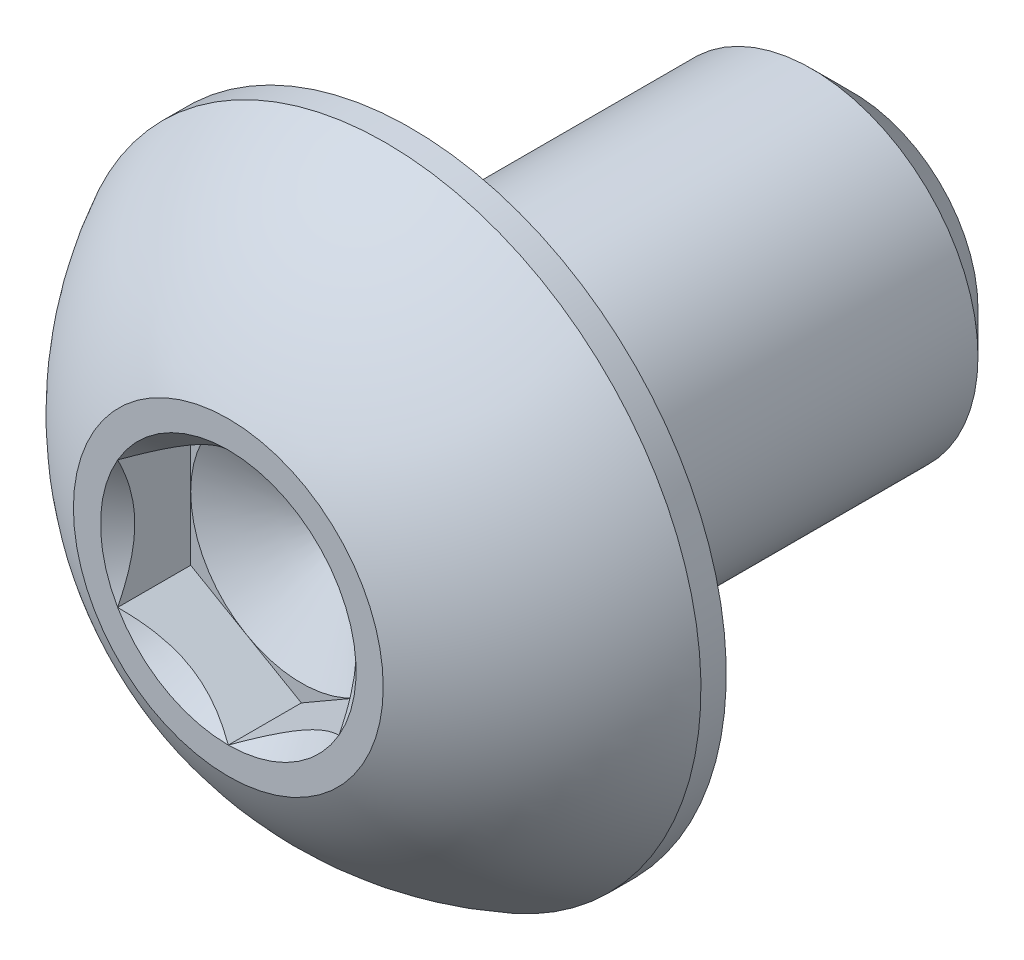
ISO-10303-21;
HEADER;
FILE_DESCRIPTION(('STEP AP214'),'2;1');
FILE_NAME('part.step','',(''),(''),'','','');
FILE_SCHEMA(('AUTOMOTIVE_DESIGN { 1 0 10303 214 1 1 1 1 }'));
ENDSEC;
DATA;
#1=APPLICATION_CONTEXT('core data for automotive mechanical design processes');
#2=APPLICATION_PROTOCOL_DEFINITION('international standard','automotive_design',2000,#1);
#3=PRODUCT_CONTEXT('',#1,'mechanical');
#4=PRODUCT('Part','Part','',(#3));
#5=PRODUCT_RELATED_PRODUCT_CATEGORY('part','',(#4));
#6=PRODUCT_DEFINITION_FORMATION('','',#4);
#7=PRODUCT_DEFINITION_CONTEXT('part definition',#1,'design');
#8=PRODUCT_DEFINITION('design','',#6,#7);
#9=PRODUCT_DEFINITION_SHAPE('','',#8);
#10=(LENGTH_UNIT() NAMED_UNIT(*) SI_UNIT(.MILLI.,.METRE.));
#11=(NAMED_UNIT(*) PLANE_ANGLE_UNIT() SI_UNIT($,.RADIAN.));
#12=(NAMED_UNIT(*) SI_UNIT($,.STERADIAN.) SOLID_ANGLE_UNIT());
#13=UNCERTAINTY_MEASURE_WITH_UNIT(LENGTH_MEASURE(1.E-05),#10,'distance_accuracy_value','');
#14=(GEOMETRIC_REPRESENTATION_CONTEXT(3) GLOBAL_UNCERTAINTY_ASSIGNED_CONTEXT((#13)) GLOBAL_UNIT_ASSIGNED_CONTEXT((#10,
#11,#12)) REPRESENTATION_CONTEXT('',''));
#15=CARTESIAN_POINT('',(0.,0.,0.));
#16=DIRECTION('',(0.,0.,1.));
#17=DIRECTION('',(1.,0.,0.));
#18=AXIS2_PLACEMENT_3D('',#15,#16,#17);
#19=CARTESIAN_POINT('',(0.,0.,2.825));
#20=DIRECTION('',(0.,0.,1.));
#21=DIRECTION('',(1.,0.,0.));
#22=AXIS2_PLACEMENT_3D('',#19,#20,#21);
#23=CONICAL_SURFACE('',#22,1.15470053837925,0.78539816339745);
#24=CARTESIAN_POINT('',(0.,0.,2.825));
#25=DIRECTION('',(0.,0.,1.));
#26=DIRECTION('',(1.,0.,0.));
#27=AXIS2_PLACEMENT_3D('',#24,#25,#26);
#28=CIRCLE('',#27,1.15470053837925);
#29=CARTESIAN_POINT('',(1.,0.577350269189626,2.825));
#30=VERTEX_POINT('',#29);
#31=CARTESIAN_POINT('',(0.,1.15470053837925,2.825));
#32=VERTEX_POINT('',#31);
#33=EDGE_CURVE('E219',#30,#32,#28,.T.);
#34=ORIENTED_EDGE('',*,*,#33,.T.);
#35=CARTESIAN_POINT('',(0.999999999999951,0.577350269189655,2.82499999999997));
#36=CARTESIAN_POINT('',(0.5,0.866025403784439,2.53632486540521));
#37=CARTESIAN_POINT('',(0.,1.15470053837922,2.82499999999997));
#38=(BOUNDED_CURVE() B_SPLINE_CURVE(2,(#35,#36,#37),.UNSPECIFIED.,.F.,
.F.) B_SPLINE_CURVE_WITH_KNOTS((3,3),(-0.3218671551163,-0.124274873543866),
.UNSPECIFIED.) CURVE() GEOMETRIC_REPRESENTATION_ITEM() RATIONAL_B_SPLINE_CURVE((1.46410161513778,
1.69059892324148,1.46410161513778)) REPRESENTATION_ITEM(''));
#39=EDGE_CURVE('E240',#30,#32,#38,.T.);
#40=ORIENTED_EDGE('',*,*,#39,.F.);
#41=EDGE_LOOP('',(#34,#40));
#42=FACE_BOUND('',#41,.T.);
#43=ADVANCED_FACE('F17',(#42),#23,.F.);
#44=CARTESIAN_POINT('',(0.,0.,2.825));
#45=DIRECTION('',(0.,0.,1.));
#46=DIRECTION('',(1.,0.,0.));
#47=AXIS2_PLACEMENT_3D('',#44,#45,#46);
#48=CONICAL_SURFACE('',#47,1.15470053837925,0.78539816339745);
#49=CARTESIAN_POINT('',(0.,0.,2.825));
#50=DIRECTION('',(0.,0.,1.));
#51=DIRECTION('',(1.,0.,0.));
#52=AXIS2_PLACEMENT_3D('',#49,#50,#51);
#53=CIRCLE('',#52,1.15470053837925);
#54=CARTESIAN_POINT('',(0.,-1.15470053837925,2.825));
#55=VERTEX_POINT('',#54);
#56=CARTESIAN_POINT('',(1.,-0.577350269189625,2.825));
#57=VERTEX_POINT('',#56);
#58=EDGE_CURVE('E223',#55,#57,#53,.T.);
#59=ORIENTED_EDGE('',*,*,#58,.T.);
#60=CARTESIAN_POINT('',(0.,-1.15470053837922,2.82499999999997));
#61=CARTESIAN_POINT('',(0.500000000000001,-0.866025403784439,2.53632486540521));
#62=CARTESIAN_POINT('',(0.999999999999951,-0.577350269189654,2.82499999999997));
#63=(BOUNDED_CURVE() B_SPLINE_CURVE(2,(#60,#61,#62),.UNSPECIFIED.,.F.,
.F.) B_SPLINE_CURVE_WITH_KNOTS((3,3),(-0.3218671551163,-0.124274873543866),
.UNSPECIFIED.) CURVE() GEOMETRIC_REPRESENTATION_ITEM() RATIONAL_B_SPLINE_CURVE((1.46410161513778,
1.69059892324148,1.46410161513778)) REPRESENTATION_ITEM(''));
#64=EDGE_CURVE('E304',#55,#57,#63,.T.);
#65=ORIENTED_EDGE('',*,*,#64,.F.);
#66=EDGE_LOOP('',(#59,#65));
#67=FACE_BOUND('',#66,.T.);
#68=ADVANCED_FACE('F320',(#67),#48,.F.);
#69=CARTESIAN_POINT('',(0.,0.,2.825));
#70=DIRECTION('',(0.,0.,1.));
#71=DIRECTION('',(1.,0.,0.));
#72=AXIS2_PLACEMENT_3D('',#69,#70,#71);
#73=CONICAL_SURFACE('',#72,1.15470053837925,0.78539816339745);
#74=CARTESIAN_POINT('',(0.,0.,2.825));
#75=DIRECTION('',(0.,0.,1.));
#76=DIRECTION('',(1.,0.,0.));
#77=AXIS2_PLACEMENT_3D('',#74,#75,#76);
#78=CIRCLE('',#77,1.15470053837925);
#79=CARTESIAN_POINT('',(-1.,-0.577350269189626,2.825));
#80=VERTEX_POINT('',#79);
#81=EDGE_CURVE('E227',#80,#55,#78,.T.);
#82=ORIENTED_EDGE('',*,*,#81,.T.);
#83=CARTESIAN_POINT('',(-0.999999999999948,-0.577350269189656,2.82499999999997));
#84=CARTESIAN_POINT('',(-0.5,-0.866025403784439,2.53632486540521));
#85=CARTESIAN_POINT('',(0.,-1.15470053837922,2.82499999999997));
#86=(BOUNDED_CURVE() B_SPLINE_CURVE(2,(#83,#84,#85),.UNSPECIFIED.,.F.,
.F.) B_SPLINE_CURVE_WITH_KNOTS((3,3),(-0.321867155116299,-0.124274873543866),
.UNSPECIFIED.) CURVE() GEOMETRIC_REPRESENTATION_ITEM() RATIONAL_B_SPLINE_CURVE((1.46410161513778,
1.69059892324148,1.46410161513778)) REPRESENTATION_ITEM(''));
#87=EDGE_CURVE('E285',#80,#55,#86,.T.);
#88=ORIENTED_EDGE('',*,*,#87,.F.);
#89=EDGE_LOOP('',(#82,#88));
#90=FACE_BOUND('',#89,.T.);
#91=ADVANCED_FACE('F395',(#90),#73,.F.);
#92=CARTESIAN_POINT('',(0.,0.,2.825));
#93=DIRECTION('',(0.,0.,1.));
#94=DIRECTION('',(-1.,0.,0.));
#95=AXIS2_PLACEMENT_3D('',#92,#93,#94);
#96=CONICAL_SURFACE('',#95,1.15470053837925,0.78539816339745);
#97=CARTESIAN_POINT('',(0.,0.,2.825));
#98=DIRECTION('',(0.,0.,1.));
#99=DIRECTION('',(1.,0.,0.));
#100=AXIS2_PLACEMENT_3D('',#97,#98,#99);
#101=CIRCLE('',#100,1.15470053837925);
#102=CARTESIAN_POINT('',(-1.,0.577350269189626,2.825));
#103=VERTEX_POINT('',#102);
#104=EDGE_CURVE('E236',#103,#80,#101,.T.);
#105=ORIENTED_EDGE('',*,*,#104,.T.);
#106=CARTESIAN_POINT('',(-1.,0.577350269189569,2.82499999999997));
#107=CARTESIAN_POINT('',(-1.,0.,2.53632486540521));
#108=CARTESIAN_POINT('',(-1.,-0.577350269189569,2.82499999999997));
#109=(BOUNDED_CURVE() B_SPLINE_CURVE(2,(#106,#107,#108),.UNSPECIFIED.,.F.,
.F.) B_SPLINE_CURVE_WITH_KNOTS((3,3),(-0.3218671551163,-0.124274873543866),
.UNSPECIFIED.) CURVE() GEOMETRIC_REPRESENTATION_ITEM() RATIONAL_B_SPLINE_CURVE((1.46410161513777,
1.69059892324148,1.46410161513777)) REPRESENTATION_ITEM(''));
#110=EDGE_CURVE('E231',#103,#80,#109,.T.);
#111=ORIENTED_EDGE('',*,*,#110,.F.);
#112=EDGE_LOOP('',(#105,#111));
#113=FACE_BOUND('',#112,.T.);
#114=ADVANCED_FACE('F416',(#113),#96,.F.);
#115=CARTESIAN_POINT('',(0.,0.,2.825));
#116=DIRECTION('',(0.,0.,1.));
#117=DIRECTION('',(1.,0.,0.));
#118=AXIS2_PLACEMENT_3D('',#115,#116,#117);
#119=CONICAL_SURFACE('',#118,1.15470053837925,0.78539816339745);
#120=CARTESIAN_POINT('',(0.,0.,2.825));
#121=DIRECTION('',(0.,0.,1.));
#122=DIRECTION('',(1.,0.,0.));
#123=AXIS2_PLACEMENT_3D('',#120,#121,#122);
#124=CIRCLE('',#123,1.15470053837925);
#125=EDGE_CURVE('E215',#32,#103,#124,.T.);
#126=ORIENTED_EDGE('',*,*,#125,.T.);
#127=CARTESIAN_POINT('',(0.,1.15470053837922,2.82499999999997));
#128=CARTESIAN_POINT('',(-0.5,0.866025403784439,2.53632486540521));
#129=CARTESIAN_POINT('',(-0.999999999999951,0.577350269189654,2.82499999999997));
#130=(BOUNDED_CURVE() B_SPLINE_CURVE(2,(#127,#128,#129),.UNSPECIFIED.,.F.,
.F.) B_SPLINE_CURVE_WITH_KNOTS((3,3),(-0.3218671551163,-0.124274873543866),
.UNSPECIFIED.) CURVE() GEOMETRIC_REPRESENTATION_ITEM() RATIONAL_B_SPLINE_CURVE((1.46410161513777,
1.69059892324148,1.46410161513777)) REPRESENTATION_ITEM(''));
#131=EDGE_CURVE('E265',#32,#103,#130,.T.);
#132=ORIENTED_EDGE('',*,*,#131,.F.);
#133=EDGE_LOOP('',(#126,#132));
#134=FACE_BOUND('',#133,.T.);
#135=ADVANCED_FACE('F399',(#134),#119,.F.);
#136=CARTESIAN_POINT('',(0.,0.,2.165));
#137=DIRECTION('',(0.,0.,1.));
#138=DIRECTION('',(1.,0.,0.));
#139=AXIS2_PLACEMENT_3D('',#136,#137,#138);
#140=PLANE('',#139);
#141=CARTESIAN_POINT('',(0.,0.,2.165));
#142=DIRECTION('',(0.,0.,1.));
#143=DIRECTION('',(1.,0.,0.));
#144=AXIS2_PLACEMENT_3D('',#141,#142,#143);
#145=CIRCLE('',#144,1.);
#146=CARTESIAN_POINT('',(1.,0.,2.165));
#147=VERTEX_POINT('',#146);
#148=CARTESIAN_POINT('',(0.5,0.866025403784439,2.165));
#149=VERTEX_POINT('',#148);
#150=EDGE_CURVE('E153',#147,#149,#145,.T.);
#151=ORIENTED_EDGE('',*,*,#150,.F.);
#152=DIRECTION('',(0.,1.,0.));
#153=VECTOR('',#152,1.);
#154=CARTESIAN_POINT('',(1.,-0.577350269189625,2.165));
#155=LINE('',#154,#153);
#156=CARTESIAN_POINT('',(1.,0.577350269189626,2.165));
#157=VERTEX_POINT('',#156);
#158=EDGE_CURVE('E25',#147,#157,#155,.T.);
#159=ORIENTED_EDGE('',*,*,#158,.T.);
#160=DIRECTION('',(-0.866025403784439,0.5,0.));
#161=VECTOR('',#160,1.);
#162=CARTESIAN_POINT('',(1.,0.577350269189626,2.165));
#163=LINE('',#162,#161);
#164=EDGE_CURVE('E155',#157,#149,#163,.T.);
#165=ORIENTED_EDGE('',*,*,#164,.T.);
#166=EDGE_LOOP('',(#151,#159,#165));
#167=FACE_BOUND('',#166,.T.);
#168=ADVANCED_FACE('F154',(#167),#140,.T.);
#169=CARTESIAN_POINT('',(0.,0.,2.165));
#170=DIRECTION('',(0.,0.,1.));
#171=DIRECTION('',(1.,0.,0.));
#172=AXIS2_PLACEMENT_3D('',#169,#170,#171);
#173=PLANE('',#172);
#174=CARTESIAN_POINT('',(0.,0.,2.165));
#175=DIRECTION('',(0.,0.,1.));
#176=DIRECTION('',(1.,0.,0.));
#177=AXIS2_PLACEMENT_3D('',#174,#175,#176);
#178=CIRCLE('',#177,1.);
#179=CARTESIAN_POINT('',(-0.5,0.866025403784438,2.165));
#180=VERTEX_POINT('',#179);
#181=EDGE_CURVE('E160',#149,#180,#178,.T.);
#182=ORIENTED_EDGE('',*,*,#181,.F.);
#183=DIRECTION('',(-0.866025403784439,0.5,0.));
#184=VECTOR('',#183,1.);
#185=CARTESIAN_POINT('',(1.,0.577350269189626,2.165));
#186=LINE('',#185,#184);
#187=CARTESIAN_POINT('',(0.,1.15470053837925,2.165));
#188=VERTEX_POINT('',#187);
#189=EDGE_CURVE('E255',#149,#188,#186,.T.);
#190=ORIENTED_EDGE('',*,*,#189,.T.);
#191=DIRECTION('',(-0.866025403784438,-0.5,0.));
#192=VECTOR('',#191,1.);
#193=CARTESIAN_POINT('',(0.,1.15470053837925,2.165));
#194=LINE('',#193,#192);
#195=EDGE_CURVE('E228',#188,#180,#194,.T.);
#196=ORIENTED_EDGE('',*,*,#195,.T.);
#197=EDGE_LOOP('',(#182,#190,#196));
#198=FACE_BOUND('',#197,.T.);
#199=ADVANCED_FACE('F408',(#198),#173,.T.);
#200=CARTESIAN_POINT('',(0.,0.,2.165));
#201=DIRECTION('',(0.,0.,1.));
#202=DIRECTION('',(1.,0.,0.));
#203=AXIS2_PLACEMENT_3D('',#200,#201,#202);
#204=PLANE('',#203);
#205=CARTESIAN_POINT('',(0.,0.,2.165));
#206=DIRECTION('',(0.,0.,1.));
#207=DIRECTION('',(1.,0.,0.));
#208=AXIS2_PLACEMENT_3D('',#205,#206,#207);
#209=CIRCLE('',#208,1.);
#210=CARTESIAN_POINT('',(-1.,0.,2.165));
#211=VERTEX_POINT('',#210);
#212=EDGE_CURVE('E178',#180,#211,#209,.T.);
#213=ORIENTED_EDGE('',*,*,#212,.F.);
#214=DIRECTION('',(-0.866025403784438,-0.5,0.));
#215=VECTOR('',#214,1.);
#216=CARTESIAN_POINT('',(0.,1.15470053837925,2.165));
#217=LINE('',#216,#215);
#218=CARTESIAN_POINT('',(-1.,0.577350269189625,2.165));
#219=VERTEX_POINT('',#218);
#220=EDGE_CURVE('E232',#180,#219,#217,.T.);
#221=ORIENTED_EDGE('',*,*,#220,.T.);
#222=DIRECTION('',(0.,-1.,0.));
#223=VECTOR('',#222,1.);
#224=CARTESIAN_POINT('',(-1.,0.577350269189625,2.165));
#225=LINE('',#224,#223);
#226=EDGE_CURVE('E282',#219,#211,#225,.T.);
#227=ORIENTED_EDGE('',*,*,#226,.T.);
#228=EDGE_LOOP('',(#213,#221,#227));
#229=FACE_BOUND('',#228,.T.);
#230=ADVANCED_FACE('F386',(#229),#204,.T.);
#231=CARTESIAN_POINT('',(0.,0.,2.165));
#232=DIRECTION('',(0.,0.,1.));
#233=DIRECTION('',(1.,0.,0.));
#234=AXIS2_PLACEMENT_3D('',#231,#232,#233);
#235=PLANE('',#234);
#236=CARTESIAN_POINT('',(0.,0.,2.165));
#237=DIRECTION('',(0.,0.,1.));
#238=DIRECTION('',(1.,0.,0.));
#239=AXIS2_PLACEMENT_3D('',#236,#237,#238);
#240=CIRCLE('',#239,1.);
#241=CARTESIAN_POINT('',(-0.5,-0.866025403784439,2.165));
#242=VERTEX_POINT('',#241);
#243=EDGE_CURVE('E173',#211,#242,#240,.T.);
#244=ORIENTED_EDGE('',*,*,#243,.F.);
#245=DIRECTION('',(0.,-1.,0.));
#246=VECTOR('',#245,1.);
#247=CARTESIAN_POINT('',(-1.,0.577350269189625,2.165));
#248=LINE('',#247,#246);
#249=CARTESIAN_POINT('',(-1.,-0.577350269189626,2.165));
#250=VERTEX_POINT('',#249);
#251=EDGE_CURVE('E278',#211,#250,#248,.T.);
#252=ORIENTED_EDGE('',*,*,#251,.T.);
#253=DIRECTION('',(0.866025403784439,-0.5,0.));
#254=VECTOR('',#253,1.);
#255=CARTESIAN_POINT('',(-1.,-0.577350269189626,2.165));
#256=LINE('',#255,#254);
#257=EDGE_CURVE('E301',#250,#242,#256,.T.);
#258=ORIENTED_EDGE('',*,*,#257,.T.);
#259=EDGE_LOOP('',(#244,#252,#258));
#260=FACE_BOUND('',#259,.T.);
#261=ADVANCED_FACE('F369',(#260),#235,.T.);
#262=CARTESIAN_POINT('',(0.,0.,2.165));
#263=DIRECTION('',(0.,0.,1.));
#264=DIRECTION('',(1.,0.,0.));
#265=AXIS2_PLACEMENT_3D('',#262,#263,#264);
#266=PLANE('',#265);
#267=CARTESIAN_POINT('',(0.,0.,2.165));
#268=DIRECTION('',(0.,0.,1.));
#269=DIRECTION('',(1.,0.,0.));
#270=AXIS2_PLACEMENT_3D('',#267,#268,#269);
#271=CIRCLE('',#270,1.);
#272=CARTESIAN_POINT('',(0.5,-0.866025403784438,2.165));
#273=VERTEX_POINT('',#272);
#274=EDGE_CURVE('E166',#242,#273,#271,.T.);
#275=ORIENTED_EDGE('',*,*,#274,.F.);
#276=DIRECTION('',(0.866025403784439,-0.5,0.));
#277=VECTOR('',#276,1.);
#278=CARTESIAN_POINT('',(-1.,-0.577350269189626,2.165));
#279=LINE('',#278,#277);
#280=CARTESIAN_POINT('',(0.,-1.15470053837925,2.165));
#281=VERTEX_POINT('',#280);
#282=EDGE_CURVE('E298',#242,#281,#279,.T.);
#283=ORIENTED_EDGE('',*,*,#282,.T.);
#284=DIRECTION('',(0.866025403784439,0.5,0.));
#285=VECTOR('',#284,1.);
#286=CARTESIAN_POINT('',(0.,-1.15470053837925,2.165));
#287=LINE('',#286,#285);
#288=EDGE_CURVE('E45',#281,#273,#287,.T.);
#289=ORIENTED_EDGE('',*,*,#288,.T.);
#290=EDGE_LOOP('',(#275,#283,#289));
#291=FACE_BOUND('',#290,.T.);
#292=ADVANCED_FACE('F376',(#291),#266,.T.);
#293=CARTESIAN_POINT('',(0.,0.,2.165));
#294=DIRECTION('',(0.,0.,1.));
#295=DIRECTION('',(1.,0.,0.));
#296=AXIS2_PLACEMENT_3D('',#293,#294,#295);
#297=PLANE('',#296);
#298=CARTESIAN_POINT('',(0.,0.,2.165));
#299=DIRECTION('',(0.,0.,1.));
#300=DIRECTION('',(1.,0.,0.));
#301=AXIS2_PLACEMENT_3D('',#298,#299,#300);
#302=CIRCLE('',#301,1.);
#303=EDGE_CURVE('E140',#273,#147,#302,.T.);
#304=ORIENTED_EDGE('',*,*,#303,.F.);
#305=DIRECTION('',(0.866025403784439,0.5,0.));
#306=VECTOR('',#305,1.);
#307=CARTESIAN_POINT('',(0.,-1.15470053837925,2.165));
#308=LINE('',#307,#306);
#309=CARTESIAN_POINT('',(1.,-0.577350269189625,2.165));
#310=VERTEX_POINT('',#309);
#311=EDGE_CURVE('E142',#273,#310,#308,.T.);
#312=ORIENTED_EDGE('',*,*,#311,.T.);
#313=DIRECTION('',(0.,1.,0.));
#314=VECTOR('',#313,1.);
#315=CARTESIAN_POINT('',(1.,-0.577350269189625,2.165));
#316=LINE('',#315,#314);
#317=EDGE_CURVE('E11',#310,#147,#316,.T.);
#318=ORIENTED_EDGE('',*,*,#317,.T.);
#319=EDGE_LOOP('',(#304,#312,#318));
#320=FACE_BOUND('',#319,.T.);
#321=ADVANCED_FACE('F138',(#320),#297,.T.);
#322=CARTESIAN_POINT('',(1.,-0.577350269189625,2.825));
#323=DIRECTION('',(-1.,0.,0.));
#324=DIRECTION('',(0.,1.,0.));
#325=AXIS2_PLACEMENT_3D('',#322,#323,#324);
#326=PLANE('',#325);
#327=CARTESIAN_POINT('',(1.,-0.577350269189568,2.82499999999997));
#328=CARTESIAN_POINT('',(1.,0.,2.53632486540521));
#329=CARTESIAN_POINT('',(1.,0.577350269189569,2.82499999999997));
#330=(BOUNDED_CURVE() B_SPLINE_CURVE(2,(#327,#328,#329),.UNSPECIFIED.,.F.,
.F.) B_SPLINE_CURVE_WITH_KNOTS((3,3),(0.124274873543866,0.3218671551163),
.UNSPECIFIED.) CURVE() GEOMETRIC_REPRESENTATION_ITEM() RATIONAL_B_SPLINE_CURVE((1.46410161513778,
1.69059892324148,1.46410161513778)) REPRESENTATION_ITEM(''));
#331=EDGE_CURVE('E333',#57,#30,#330,.T.);
#332=ORIENTED_EDGE('',*,*,#331,.T.);
#333=DIRECTION('',(0.,0.,-1.));
#334=VECTOR('',#333,1.);
#335=CARTESIAN_POINT('',(1.,0.577350269189626,2.825));
#336=LINE('',#335,#334);
#337=EDGE_CURVE('E148',#30,#157,#336,.T.);
#338=ORIENTED_EDGE('',*,*,#337,.T.);
#339=ORIENTED_EDGE('',*,*,#158,.F.);
#340=ORIENTED_EDGE('',*,*,#317,.F.);
#341=DIRECTION('',(0.,0.,-1.));
#342=VECTOR('',#341,1.);
#343=CARTESIAN_POINT('',(1.,-0.577350269189625,2.825));
#344=LINE('',#343,#342);
#345=EDGE_CURVE('E204',#57,#310,#344,.T.);
#346=ORIENTED_EDGE('',*,*,#345,.F.);
#347=EDGE_LOOP('',(#332,#338,#339,#340,#346));
#348=FACE_BOUND('',#347,.T.);
#349=ADVANCED_FACE('F147',(#348),#326,.T.);
#350=CARTESIAN_POINT('',(0.,-1.15470053837925,2.825));
#351=DIRECTION('',(-0.5,0.866025403784439,0.));
#352=DIRECTION('',(0.,0.,1.));
#353=AXIS2_PLACEMENT_3D('',#350,#351,#352);
#354=PLANE('',#353);
#355=ORIENTED_EDGE('',*,*,#64,.T.);
#356=ORIENTED_EDGE('',*,*,#345,.T.);
#357=ORIENTED_EDGE('',*,*,#311,.F.);
#358=ORIENTED_EDGE('',*,*,#288,.F.);
#359=DIRECTION('',(0.,0.,-1.));
#360=VECTOR('',#359,1.);
#361=CARTESIAN_POINT('',(0.,-1.15470053837925,2.825));
#362=LINE('',#361,#360);
#363=EDGE_CURVE('E291',#55,#281,#362,.T.);
#364=ORIENTED_EDGE('',*,*,#363,.F.);
#365=EDGE_LOOP('',(#355,#356,#357,#358,#364));
#366=FACE_BOUND('',#365,.T.);
#367=ADVANCED_FACE('F316',(#366),#354,.T.);
#368=CARTESIAN_POINT('',(-1.,-0.577350269189626,2.825));
#369=DIRECTION('',(0.5,0.866025403784439,0.));
#370=DIRECTION('',(0.,0.,-1.));
#371=AXIS2_PLACEMENT_3D('',#368,#369,#370);
#372=PLANE('',#371);
#373=ORIENTED_EDGE('',*,*,#87,.T.);
#374=ORIENTED_EDGE('',*,*,#363,.T.);
#375=ORIENTED_EDGE('',*,*,#282,.F.);
#376=ORIENTED_EDGE('',*,*,#257,.F.);
#377=DIRECTION('',(0.,0.,-1.));
#378=VECTOR('',#377,1.);
#379=CARTESIAN_POINT('',(-1.,-0.577350269189626,2.825));
#380=LINE('',#379,#378);
#381=EDGE_CURVE('E271',#80,#250,#380,.T.);
#382=ORIENTED_EDGE('',*,*,#381,.F.);
#383=EDGE_LOOP('',(#373,#374,#375,#376,#382));
#384=FACE_BOUND('',#383,.T.);
#385=ADVANCED_FACE('F374',(#384),#372,.T.);
#386=CARTESIAN_POINT('',(-1.,0.577350269189625,2.825));
#387=DIRECTION('',(1.,0.,0.));
#388=DIRECTION('',(0.,1.,0.));
#389=AXIS2_PLACEMENT_3D('',#386,#387,#388);
#390=PLANE('',#389);
#391=ORIENTED_EDGE('',*,*,#110,.T.);
#392=ORIENTED_EDGE('',*,*,#381,.T.);
#393=ORIENTED_EDGE('',*,*,#251,.F.);
#394=ORIENTED_EDGE('',*,*,#226,.F.);
#395=DIRECTION('',(0.,0.,-1.));
#396=VECTOR('',#395,1.);
#397=CARTESIAN_POINT('',(-1.,0.577350269189625,2.825));
#398=LINE('',#397,#396);
#399=EDGE_CURVE('E261',#103,#219,#398,.T.);
#400=ORIENTED_EDGE('',*,*,#399,.F.);
#401=EDGE_LOOP('',(#391,#392,#393,#394,#400));
#402=FACE_BOUND('',#401,.T.);
#403=ADVANCED_FACE('F413',(#402),#390,.T.);
#404=CARTESIAN_POINT('',(0.,1.15470053837925,2.825));
#405=DIRECTION('',(0.5,-0.866025403784438,0.));
#406=DIRECTION('',(0.,0.,-1.));
#407=AXIS2_PLACEMENT_3D('',#404,#405,#406);
#408=PLANE('',#407);
#409=ORIENTED_EDGE('',*,*,#131,.T.);
#410=ORIENTED_EDGE('',*,*,#399,.T.);
#411=ORIENTED_EDGE('',*,*,#220,.F.);
#412=ORIENTED_EDGE('',*,*,#195,.F.);
#413=DIRECTION('',(0.,0.,-1.));
#414=VECTOR('',#413,1.);
#415=CARTESIAN_POINT('',(0.,1.15470053837925,2.825));
#416=LINE('',#415,#414);
#417=EDGE_CURVE('E246',#32,#188,#416,.T.);
#418=ORIENTED_EDGE('',*,*,#417,.F.);
#419=EDGE_LOOP('',(#409,#410,#411,#412,#418));
#420=FACE_BOUND('',#419,.T.);
#421=ADVANCED_FACE('F402',(#420),#408,.T.);
#422=CARTESIAN_POINT('',(1.,0.577350269189626,2.825));
#423=DIRECTION('',(-0.5,-0.866025403784439,0.));
#424=DIRECTION('',(-0.866025403784439,0.5,0.));
#425=AXIS2_PLACEMENT_3D('',#422,#423,#424);
#426=PLANE('',#425);
#427=ORIENTED_EDGE('',*,*,#39,.T.);
#428=ORIENTED_EDGE('',*,*,#417,.T.);
#429=ORIENTED_EDGE('',*,*,#189,.F.);
#430=ORIENTED_EDGE('',*,*,#164,.F.);
#431=ORIENTED_EDGE('',*,*,#337,.F.);
#432=EDGE_LOOP('',(#427,#428,#429,#430,#431));
#433=FACE_BOUND('',#432,.T.);
#434=ADVANCED_FACE('F405',(#433),#426,.T.);
#435=CARTESIAN_POINT('',(0.,1.125,-2.825));
#436=DIRECTION('',(0.,0.,1.));
#437=DIRECTION('',(1.,0.,0.));
#438=AXIS2_PLACEMENT_3D('',#435,#436,#437);
#439=PLANE('',#438);
#440=CARTESIAN_POINT('',(0.,0.,-2.825));
#441=DIRECTION('',(0.,0.,1.));
#442=DIRECTION('',(1.,0.,0.));
#443=AXIS2_PLACEMENT_3D('',#440,#441,#442);
#444=CIRCLE('',#443,1.125);
#445=CARTESIAN_POINT('',(-1.125,0.,-2.825));
#446=VERTEX_POINT('',#445);
#447=EDGE_CURVE('E212',#446,#446,#444,.T.);
#448=ORIENTED_EDGE('',*,*,#447,.F.);
#449=EDGE_LOOP('',(#448));
#450=FACE_BOUND('',#449,.T.);
#451=ADVANCED_FACE('F533',(#450),#439,.F.);
#452=CARTESIAN_POINT('',(0.,2.85,1.175));
#453=DIRECTION('',(0.,0.,1.));
#454=DIRECTION('',(1.,0.,0.));
#455=AXIS2_PLACEMENT_3D('',#452,#453,#454);
#456=PLANE('',#455);
#457=CARTESIAN_POINT('',(0.,0.,1.175));
#458=DIRECTION('',(0.,0.,1.));
#459=DIRECTION('',(1.,0.,0.));
#460=AXIS2_PLACEMENT_3D('',#457,#458,#459);
#461=CIRCLE('',#460,1.5);
#462=CARTESIAN_POINT('',(-1.5,0.,1.175));
#463=VERTEX_POINT('',#462);
#464=EDGE_CURVE('E193',#463,#463,#461,.T.);
#465=ORIENTED_EDGE('',*,*,#464,.T.);
#466=EDGE_LOOP('',(#465));
#467=FACE_BOUND('',#466,.T.);
#468=CARTESIAN_POINT('',(0.,0.,1.175));
#469=DIRECTION('',(0.,0.,1.));
#470=DIRECTION('',(1.,0.,0.));
#471=AXIS2_PLACEMENT_3D('',#468,#469,#470);
#472=CIRCLE('',#471,2.85);
#473=CARTESIAN_POINT('',(-2.85,0.,1.175));
#474=VERTEX_POINT('',#473);
#475=EDGE_CURVE('E190',#474,#474,#472,.T.);
#476=ORIENTED_EDGE('',*,*,#475,.F.);
#477=EDGE_LOOP('',(#476));
#478=FACE_BOUND('',#477,.T.);
#479=ADVANCED_FACE('F541',(#467,#478),#456,.F.);
#480=CARTESIAN_POINT('',(0.,1.,2.825));
#481=DIRECTION('',(0.,0.,-1.));
#482=DIRECTION('',(0.,-1.,0.));
#483=AXIS2_PLACEMENT_3D('',#480,#481,#482);
#484=PLANE('',#483);
#485=ORIENTED_EDGE('',*,*,#125,.F.);
#486=ORIENTED_EDGE('',*,*,#33,.F.);
#487=CARTESIAN_POINT('',(0.,0.,2.825));
#488=DIRECTION('',(0.,0.,1.));
#489=DIRECTION('',(1.,0.,0.));
#490=AXIS2_PLACEMENT_3D('',#487,#488,#489);
#491=CIRCLE('',#490,1.15470053837925);
#492=EDGE_CURVE('E325',#57,#30,#491,.T.);
#493=ORIENTED_EDGE('',*,*,#492,.F.);
#494=ORIENTED_EDGE('',*,*,#58,.F.);
#495=ORIENTED_EDGE('',*,*,#81,.F.);
#496=ORIENTED_EDGE('',*,*,#104,.F.);
#497=EDGE_LOOP('',(#485,#486,#493,#494,#495,#496));
#498=FACE_BOUND('',#497,.T.);
#499=CARTESIAN_POINT('',(0.,0.,2.825));
#500=DIRECTION('',(0.,0.,1.));
#501=DIRECTION('',(1.,0.,0.));
#502=AXIS2_PLACEMENT_3D('',#499,#500,#501);
#503=CIRCLE('',#502,1.4);
#504=CARTESIAN_POINT('',(0.,1.4,2.825));
#505=VERTEX_POINT('',#504);
#506=EDGE_CURVE('E183',#505,#505,#503,.T.);
#507=ORIENTED_EDGE('',*,*,#506,.T.);
#508=EDGE_LOOP('',(#507));
#509=FACE_BOUND('',#508,.T.);
#510=ADVANCED_FACE('F328',(#498,#509),#484,.F.);
#511=CARTESIAN_POINT('',(0.,0.,-2.825));
#512=DIRECTION('',(0.,0.,1.));
#513=DIRECTION('',(1.,0.,0.));
#514=AXIS2_PLACEMENT_3D('',#511,#512,#513);
#515=CONICAL_SURFACE('',#514,1.125,0.785398163397447);
#516=CARTESIAN_POINT('',(0.,0.,-2.45));
#517=DIRECTION('',(0.,0.,1.));
#518=DIRECTION('',(1.,0.,0.));
#519=AXIS2_PLACEMENT_3D('',#516,#517,#518);
#520=CIRCLE('',#519,1.5);
#521=CARTESIAN_POINT('',(-1.5,0.,-2.45));
#522=VERTEX_POINT('',#521);
#523=EDGE_CURVE('E201',#522,#522,#520,.T.);
#524=ORIENTED_EDGE('',*,*,#523,.F.);
#525=DIRECTION('',(0.707106781186547,0.,-0.707106781186549));
#526=VECTOR('',#525,1.);
#527=CARTESIAN_POINT('',(-1.125,0.,-2.825));
#528=LINE('',#527,#526);
#529=EDGE_CURVE('E208',#522,#446,#528,.T.);
#530=ORIENTED_EDGE('',*,*,#529,.T.);
#531=ORIENTED_EDGE('',*,*,#447,.T.);
#532=ORIENTED_EDGE('',*,*,#529,.F.);
#533=EDGE_LOOP('',(#524,#530,#531,#532));
#534=FACE_BOUND('',#533,.T.);
#535=ADVANCED_FACE('F559',(#534),#515,.T.);
#536=CARTESIAN_POINT('',(0.,0.,2.825));
#537=DIRECTION('',(0.,0.,1.));
#538=DIRECTION('',(1.,0.,0.));
#539=AXIS2_PLACEMENT_3D('',#536,#537,#538);
#540=CYLINDRICAL_SURFACE('',#539,1.5);
#541=ORIENTED_EDGE('',*,*,#464,.F.);
#542=DIRECTION('',(0.,0.,-1.));
#543=VECTOR('',#542,1.);
#544=CARTESIAN_POINT('',(-1.5,0.,2.825));
#545=LINE('',#544,#543);
#546=EDGE_CURVE('E197',#463,#522,#545,.T.);
#547=ORIENTED_EDGE('',*,*,#546,.T.);
#548=ORIENTED_EDGE('',*,*,#523,.T.);
#549=ORIENTED_EDGE('',*,*,#546,.F.);
#550=EDGE_LOOP('',(#541,#547,#548,#549));
#551=FACE_BOUND('',#550,.T.);
#552=ADVANCED_FACE('F564',(#551),#540,.T.);
#553=CARTESIAN_POINT('',(0.,0.,2.825));
#554=DIRECTION('',(0.,0.,1.));
#555=DIRECTION('',(1.,0.,0.));
#556=AXIS2_PLACEMENT_3D('',#553,#554,#555);
#557=CYLINDRICAL_SURFACE('',#556,2.85);
#558=CARTESIAN_POINT('',(0.,0.,1.40357142857143));
#559=DIRECTION('',(0.,0.,1.));
#560=DIRECTION('',(1.,0.,0.));
#561=AXIS2_PLACEMENT_3D('',#558,#559,#560);
#562=CIRCLE('',#561,2.85);
#563=CARTESIAN_POINT('',(-2.85,0.,1.40357142857143));
#564=VERTEX_POINT('',#563);
#565=EDGE_CURVE('E179',#564,#564,#562,.T.);
#566=ORIENTED_EDGE('',*,*,#565,.F.);
#567=DIRECTION('',(0.,0.,-1.));
#568=VECTOR('',#567,1.);
#569=CARTESIAN_POINT('',(-2.85,0.,2.825));
#570=LINE('',#569,#568);
#571=EDGE_CURVE('E186',#564,#474,#570,.T.);
#572=ORIENTED_EDGE('',*,*,#571,.T.);
#573=ORIENTED_EDGE('',*,*,#475,.T.);
#574=ORIENTED_EDGE('',*,*,#571,.F.);
#575=EDGE_LOOP('',(#566,#572,#573,#574));
#576=FACE_BOUND('',#575,.T.);
#577=ADVANCED_FACE('F573',(#576),#557,.T.);
#578=CARTESIAN_POINT('',(0.,0.,-0.0534278535534796));
#579=DIRECTION('',(-1.,0.,0.));
#580=DIRECTION('',(0.,1.,0.));
#581=AXIS2_PLACEMENT_3D('',#578,#579,#580);
#582=SPHERICAL_SURFACE('',#581,3.20083534536103);
#583=CARTESIAN_POINT('',(0.,0.,-0.0534278535534796));
#584=DIRECTION('',(0.,0.,1.));
#585=DIRECTION('',(1.,0.,0.));
#586=AXIS2_PLACEMENT_3D('',#583,#584,#585);
#587=SPHERICAL_SURFACE('',#586,3.20083534536103);
#588=ORIENTED_EDGE('',*,*,#506,.F.);
#589=EDGE_LOOP('',(#588));
#590=FACE_BOUND('',#589,.T.);
#591=ORIENTED_EDGE('',*,*,#565,.T.);
#592=EDGE_LOOP('',(#591));
#593=FACE_BOUND('',#592,.T.);
#594=ADVANCED_FACE('F582',(#590,#593),#587,.T.);
#595=CARTESIAN_POINT('',(0.,0.,2.165));
#596=DIRECTION('',(0.,0.,1.));
#597=DIRECTION('',(1.,0.,0.));
#598=AXIS2_PLACEMENT_3D('',#595,#596,#597);
#599=CONICAL_SURFACE('',#598,1.,1.0471975511966);
#600=DIRECTION('',(-0.86602540378444,0.,0.5));
#601=VECTOR('',#600,1.);
#602=CARTESIAN_POINT('',(-1.,0.,2.165));
#603=LINE('',#602,#601);
#604=CARTESIAN_POINT('',(0.,0.,1.58764973081038));
#605=VERTEX_POINT('',#604);
#606=EDGE_CURVE('E332',#605,#211,#603,.T.);
#607=ORIENTED_EDGE('',*,*,#606,.T.);
#608=ORIENTED_EDGE('',*,*,#243,.T.);
#609=ORIENTED_EDGE('',*,*,#274,.T.);
#610=ORIENTED_EDGE('',*,*,#303,.T.);
#611=ORIENTED_EDGE('',*,*,#150,.T.);
#612=ORIENTED_EDGE('',*,*,#181,.T.);
#613=ORIENTED_EDGE('',*,*,#212,.T.);
#614=ORIENTED_EDGE('',*,*,#606,.F.);
#615=EDGE_LOOP('',(#607,#608,#609,#610,#611,#612,#613,#614));
#616=FACE_BOUND('',#615,.T.);
#617=ADVANCED_FACE('F163',(#616),#599,.F.);
#618=CARTESIAN_POINT('',(0.,0.,2.825));
#619=DIRECTION('',(0.,0.,1.));
#620=DIRECTION('',(1.,0.,0.));
#621=AXIS2_PLACEMENT_3D('',#618,#619,#620);
#622=CONICAL_SURFACE('',#621,1.15470053837925,0.78539816339745);
#623=ORIENTED_EDGE('',*,*,#331,.F.);
#624=ORIENTED_EDGE('',*,*,#492,.T.);
#625=EDGE_LOOP('',(#623,#624));
#626=FACE_BOUND('',#625,.T.);
#627=ADVANCED_FACE('F335',(#626),#622,.F.);
#628=CLOSED_SHELL('',(#43,#68,#91,#114,#135,#168,#199,#230,#261,#292,#321,#349,#367,#385,#403,
#421,#434,#451,#479,#510,#535,#552,#577,#594,#617,#627));
#629=MANIFOLD_SOLID_BREP('B1',#628);
#630=ADVANCED_BREP_SHAPE_REPRESENTATION('',(#18,#629),#14);
#631=SHAPE_DEFINITION_REPRESENTATION(#9,#630);
ENDSEC;
END-ISO-10303-21;
